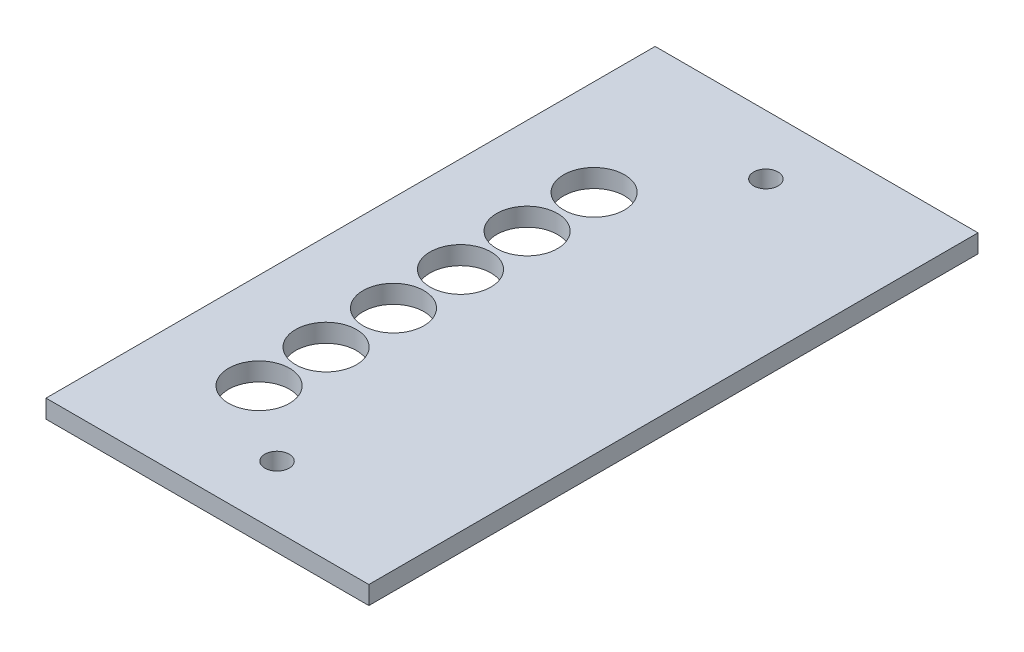
ISO-10303-21;
HEADER;
FILE_DESCRIPTION(('STEP AP214'),'2;1');
FILE_NAME('part.step','',(''),(''),'','','');
FILE_SCHEMA(('AUTOMOTIVE_DESIGN { 1 0 10303 214 1 1 1 1 }'));
ENDSEC;
DATA;
#1=APPLICATION_CONTEXT('core data for automotive mechanical design processes');
#2=APPLICATION_PROTOCOL_DEFINITION('international standard','automotive_design',2000,#1);
#3=PRODUCT_CONTEXT('',#1,'mechanical');
#4=PRODUCT('Part','Part','',(#3));
#5=PRODUCT_RELATED_PRODUCT_CATEGORY('part','',(#4));
#6=PRODUCT_DEFINITION_FORMATION('','',#4);
#7=PRODUCT_DEFINITION_CONTEXT('part definition',#1,'design');
#8=PRODUCT_DEFINITION('design','',#6,#7);
#9=PRODUCT_DEFINITION_SHAPE('','',#8);
#10=(LENGTH_UNIT() NAMED_UNIT(*) SI_UNIT(.MILLI.,.METRE.));
#11=(NAMED_UNIT(*) PLANE_ANGLE_UNIT() SI_UNIT($,.RADIAN.));
#12=(NAMED_UNIT(*) SI_UNIT($,.STERADIAN.) SOLID_ANGLE_UNIT());
#13=UNCERTAINTY_MEASURE_WITH_UNIT(LENGTH_MEASURE(1.E-05),#10,'distance_accuracy_value','');
#14=(GEOMETRIC_REPRESENTATION_CONTEXT(3) GLOBAL_UNCERTAINTY_ASSIGNED_CONTEXT((#13)) GLOBAL_UNIT_ASSIGNED_CONTEXT((#10,
#11,#12)) REPRESENTATION_CONTEXT('',''));
#15=CARTESIAN_POINT('',(0.,0.,0.));
#16=DIRECTION('',(0.,0.,1.));
#17=DIRECTION('',(1.,0.,0.));
#18=AXIS2_PLACEMENT_3D('',#15,#16,#17);
#19=CARTESIAN_POINT('',(-55.7335730143766,3.,-105.758743908447));
#20=DIRECTION('',(1.,0.,0.));
#21=DIRECTION('',(0.,0.,-1.));
#22=AXIS2_PLACEMENT_3D('',#19,#20,#21);
#23=PLANE('',#22);
#24=DIRECTION('',(0.,0.,1.));
#25=VECTOR('',#24,1.);
#26=CARTESIAN_POINT('',(-55.7335730143766,0.,-105.758743908447));
#27=LINE('',#26,#25);
#28=CARTESIAN_POINT('',(-55.7335730143766,0.,-105.758743908447));
#29=VERTEX_POINT('',#28);
#30=CARTESIAN_POINT('',(-55.7335730143766,0.,-5.75874390844709));
#31=VERTEX_POINT('',#30);
#32=EDGE_CURVE('E112',#29,#31,#27,.T.);
#33=ORIENTED_EDGE('',*,*,#32,.T.);
#34=DIRECTION('',(0.,-1.,0.));
#35=VECTOR('',#34,1.);
#36=CARTESIAN_POINT('',(-55.7335730143766,3.,-5.75874390844709));
#37=LINE('',#36,#35);
#38=CARTESIAN_POINT('',(-55.7335730143766,3.,-5.75874390844709));
#39=VERTEX_POINT('',#38);
#40=EDGE_CURVE('E11',#39,#31,#37,.T.);
#41=ORIENTED_EDGE('',*,*,#40,.F.);
#42=DIRECTION('',(0.,0.,1.));
#43=VECTOR('',#42,1.);
#44=CARTESIAN_POINT('',(-55.7335730143766,3.,-105.758743908447));
#45=LINE('',#44,#43);
#46=CARTESIAN_POINT('',(-55.7335730143766,3.,-105.758743908447));
#47=VERTEX_POINT('',#46);
#48=EDGE_CURVE('E93',#47,#39,#45,.T.);
#49=ORIENTED_EDGE('',*,*,#48,.F.);
#50=DIRECTION('',(0.,-1.,0.));
#51=VECTOR('',#50,1.);
#52=CARTESIAN_POINT('',(-55.7335730143766,3.,-105.758743908447));
#53=LINE('',#52,#51);
#54=EDGE_CURVE('E60',#47,#29,#53,.T.);
#55=ORIENTED_EDGE('',*,*,#54,.T.);
#56=EDGE_LOOP('',(#33,#41,#49,#55));
#57=FACE_BOUND('',#56,.T.);
#58=ADVANCED_FACE('F41',(#57),#23,.F.);
#59=CARTESIAN_POINT('',(-55.7335730143766,3.,-5.75874390844709));
#60=DIRECTION('',(0.,0.,-1.));
#61=DIRECTION('',(-1.,0.,0.));
#62=AXIS2_PLACEMENT_3D('',#59,#60,#61);
#63=PLANE('',#62);
#64=DIRECTION('',(1.,0.,0.));
#65=VECTOR('',#64,1.);
#66=CARTESIAN_POINT('',(-55.7335730143766,0.,-5.75874390844709));
#67=LINE('',#66,#65);
#68=CARTESIAN_POINT('',(-2.73357301437657,0.,-5.75874390844709));
#69=VERTEX_POINT('',#68);
#70=EDGE_CURVE('E99',#31,#69,#67,.T.);
#71=ORIENTED_EDGE('',*,*,#70,.T.);
#72=DIRECTION('',(0.,-1.,0.));
#73=VECTOR('',#72,1.);
#74=CARTESIAN_POINT('',(-2.73357301437657,3.,-5.75874390844709));
#75=LINE('',#74,#73);
#76=CARTESIAN_POINT('',(-2.73357301437657,3.,-5.75874390844709));
#77=VERTEX_POINT('',#76);
#78=EDGE_CURVE('E51',#77,#69,#75,.T.);
#79=ORIENTED_EDGE('',*,*,#78,.F.);
#80=DIRECTION('',(1.,0.,0.));
#81=VECTOR('',#80,1.);
#82=CARTESIAN_POINT('',(-55.7335730143766,3.,-5.75874390844709));
#83=LINE('',#82,#81);
#84=EDGE_CURVE('E85',#39,#77,#83,.T.);
#85=ORIENTED_EDGE('',*,*,#84,.F.);
#86=ORIENTED_EDGE('',*,*,#40,.T.);
#87=EDGE_LOOP('',(#71,#79,#85,#86));
#88=FACE_BOUND('',#87,.T.);
#89=ADVANCED_FACE('F98',(#88),#63,.F.);
#90=CARTESIAN_POINT('',(-2.73357301437659,3.,-105.758743908447));
#91=DIRECTION('',(1.,0.,0.));
#92=DIRECTION('',(0.,0.,-1.));
#93=AXIS2_PLACEMENT_3D('',#90,#91,#92);
#94=PLANE('',#93);
#95=DIRECTION('',(0.,0.,1.));
#96=VECTOR('',#95,1.);
#97=CARTESIAN_POINT('',(-2.73357301437659,0.,-105.758743908447));
#98=LINE('',#97,#96);
#99=CARTESIAN_POINT('',(-2.73357301437659,0.,-105.758743908447));
#100=VERTEX_POINT('',#99);
#101=EDGE_CURVE('E118',#100,#69,#98,.T.);
#102=ORIENTED_EDGE('',*,*,#101,.F.);
#103=DIRECTION('',(0.,-1.,0.));
#104=VECTOR('',#103,1.);
#105=CARTESIAN_POINT('',(-2.73357301437659,3.,-105.758743908447));
#106=LINE('',#105,#104);
#107=CARTESIAN_POINT('',(-2.73357301437659,3.,-105.758743908447));
#108=VERTEX_POINT('',#107);
#109=EDGE_CURVE('E74',#108,#100,#106,.T.);
#110=ORIENTED_EDGE('',*,*,#109,.F.);
#111=DIRECTION('',(0.,0.,1.));
#112=VECTOR('',#111,1.);
#113=CARTESIAN_POINT('',(-2.73357301437659,3.,-105.758743908447));
#114=LINE('',#113,#112);
#115=EDGE_CURVE('E92',#108,#77,#114,.T.);
#116=ORIENTED_EDGE('',*,*,#115,.T.);
#117=ORIENTED_EDGE('',*,*,#78,.T.);
#118=EDGE_LOOP('',(#102,#110,#116,#117));
#119=FACE_BOUND('',#118,.T.);
#120=ADVANCED_FACE('F104',(#119),#94,.T.);
#121=CARTESIAN_POINT('',(-55.7335730143766,3.,-105.758743908447));
#122=DIRECTION('',(0.,0.,-1.));
#123=DIRECTION('',(-1.,0.,0.));
#124=AXIS2_PLACEMENT_3D('',#121,#122,#123);
#125=PLANE('',#124);
#126=DIRECTION('',(1.,0.,0.));
#127=VECTOR('',#126,1.);
#128=CARTESIAN_POINT('',(-55.7335730143766,0.,-105.758743908447));
#129=LINE('',#128,#127);
#130=EDGE_CURVE('E121',#29,#100,#129,.T.);
#131=ORIENTED_EDGE('',*,*,#130,.F.);
#132=ORIENTED_EDGE('',*,*,#54,.F.);
#133=DIRECTION('',(1.,0.,0.));
#134=VECTOR('',#133,1.);
#135=CARTESIAN_POINT('',(-55.7335730143766,3.,-105.758743908447));
#136=LINE('',#135,#134);
#137=EDGE_CURVE('E106',#47,#108,#136,.T.);
#138=ORIENTED_EDGE('',*,*,#137,.T.);
#139=ORIENTED_EDGE('',*,*,#109,.T.);
#140=EDGE_LOOP('',(#131,#132,#138,#139));
#141=FACE_BOUND('',#140,.T.);
#142=ADVANCED_FACE('F214',(#141),#125,.T.);
#143=CARTESIAN_POINT('',(0.,3.,0.));
#144=DIRECTION('',(0.,1.,0.));
#145=DIRECTION('',(0.,0.,1.));
#146=AXIS2_PLACEMENT_3D('',#143,#144,#145);
#147=PLANE('',#146);
#148=CARTESIAN_POINT('',(-27.8029030923638,3.,-96.));
#149=DIRECTION('',(0.,1.,0.));
#150=DIRECTION('',(0.,0.,1.));
#151=AXIS2_PLACEMENT_3D('',#148,#149,#150);
#152=CIRCLE('',#151,2.);
#153=CARTESIAN_POINT('',(-27.8029030923638,3.,-94.));
#154=VERTEX_POINT('',#153);
#155=EDGE_CURVE('E188',#154,#154,#152,.T.);
#156=ORIENTED_EDGE('',*,*,#155,.F.);
#157=EDGE_LOOP('',(#156));
#158=FACE_BOUND('',#157,.T.);
#159=CARTESIAN_POINT('',(-40.,3.,-25.));
#160=DIRECTION('',(0.,1.,0.));
#161=DIRECTION('',(0.,0.,1.));
#162=AXIS2_PLACEMENT_3D('',#159,#160,#161);
#163=CIRCLE('',#162,5.);
#164=CARTESIAN_POINT('',(-40.,3.,-20.));
#165=VERTEX_POINT('',#164);
#166=EDGE_CURVE('E138',#165,#165,#163,.T.);
#167=ORIENTED_EDGE('',*,*,#166,.F.);
#168=EDGE_LOOP('',(#167));
#169=FACE_BOUND('',#168,.T.);
#170=CARTESIAN_POINT('',(-40.,3.,-36.));
#171=DIRECTION('',(0.,1.,0.));
#172=DIRECTION('',(0.,0.,1.));
#173=AXIS2_PLACEMENT_3D('',#170,#171,#172);
#174=CIRCLE('',#173,5.);
#175=CARTESIAN_POINT('',(-40.,3.,-31.));
#176=VERTEX_POINT('',#175);
#177=EDGE_CURVE('E181',#176,#176,#174,.T.);
#178=ORIENTED_EDGE('',*,*,#177,.F.);
#179=EDGE_LOOP('',(#178));
#180=FACE_BOUND('',#179,.T.);
#181=CARTESIAN_POINT('',(-40.,3.,-47.07));
#182=DIRECTION('',(0.,1.,0.));
#183=DIRECTION('',(0.,0.,1.));
#184=AXIS2_PLACEMENT_3D('',#181,#182,#183);
#185=CIRCLE('',#184,5.);
#186=CARTESIAN_POINT('',(-40.,3.,-42.07));
#187=VERTEX_POINT('',#186);
#188=EDGE_CURVE('E177',#187,#187,#185,.T.);
#189=ORIENTED_EDGE('',*,*,#188,.F.);
#190=EDGE_LOOP('',(#189));
#191=FACE_BOUND('',#190,.T.);
#192=CARTESIAN_POINT('',(-40.,3.,-58.07));
#193=DIRECTION('',(0.,1.,0.));
#194=DIRECTION('',(0.,0.,1.));
#195=AXIS2_PLACEMENT_3D('',#192,#193,#194);
#196=CIRCLE('',#195,5.);
#197=CARTESIAN_POINT('',(-40.,3.,-53.07));
#198=VERTEX_POINT('',#197);
#199=EDGE_CURVE('E173',#198,#198,#196,.T.);
#200=ORIENTED_EDGE('',*,*,#199,.F.);
#201=EDGE_LOOP('',(#200));
#202=FACE_BOUND('',#201,.T.);
#203=CARTESIAN_POINT('',(-40.,3.,-69.));
#204=DIRECTION('',(0.,1.,0.));
#205=DIRECTION('',(0.,0.,1.));
#206=AXIS2_PLACEMENT_3D('',#203,#204,#205);
#207=CIRCLE('',#206,5.00000000000001);
#208=CARTESIAN_POINT('',(-40.,3.,-64.));
#209=VERTEX_POINT('',#208);
#210=EDGE_CURVE('E169',#209,#209,#207,.T.);
#211=ORIENTED_EDGE('',*,*,#210,.F.);
#212=EDGE_LOOP('',(#211));
#213=FACE_BOUND('',#212,.T.);
#214=CARTESIAN_POINT('',(-40.,3.,-80.));
#215=DIRECTION('',(0.,1.,0.));
#216=DIRECTION('',(0.,0.,1.));
#217=AXIS2_PLACEMENT_3D('',#214,#215,#216);
#218=CIRCLE('',#217,5.00000000000001);
#219=CARTESIAN_POINT('',(-40.,3.,-75.));
#220=VERTEX_POINT('',#219);
#221=EDGE_CURVE('E164',#220,#220,#218,.T.);
#222=ORIENTED_EDGE('',*,*,#221,.F.);
#223=EDGE_LOOP('',(#222));
#224=FACE_BOUND('',#223,.T.);
#225=CARTESIAN_POINT('',(-27.8029030923637,3.,-15.7587439084471));
#226=DIRECTION('',(0.,1.,0.));
#227=DIRECTION('',(0.,0.,1.));
#228=AXIS2_PLACEMENT_3D('',#225,#226,#227);
#229=CIRCLE('',#228,2.);
#230=CARTESIAN_POINT('',(-27.8029030923637,3.,-13.7587439084471));
#231=VERTEX_POINT('',#230);
#232=EDGE_CURVE('E132',#231,#231,#229,.T.);
#233=ORIENTED_EDGE('',*,*,#232,.F.);
#234=EDGE_LOOP('',(#233));
#235=FACE_BOUND('',#234,.T.);
#236=ORIENTED_EDGE('',*,*,#48,.T.);
#237=ORIENTED_EDGE('',*,*,#84,.T.);
#238=ORIENTED_EDGE('',*,*,#115,.F.);
#239=ORIENTED_EDGE('',*,*,#137,.F.);
#240=EDGE_LOOP('',(#236,#237,#238,#239));
#241=FACE_BOUND('',#240,.T.);
#242=ADVANCED_FACE('F89',(#158,#169,#180,#191,#202,#213,#224,#235,#241),#147,.T.);
#243=CARTESIAN_POINT('',(0.,0.,0.));
#244=DIRECTION('',(0.,1.,0.));
#245=DIRECTION('',(0.,0.,1.));
#246=AXIS2_PLACEMENT_3D('',#243,#244,#245);
#247=PLANE('',#246);
#248=CARTESIAN_POINT('',(-27.8029030923638,0.,-96.));
#249=DIRECTION('',(0.,1.,0.));
#250=DIRECTION('',(0.,0.,1.));
#251=AXIS2_PLACEMENT_3D('',#248,#249,#250);
#252=CIRCLE('',#251,2.);
#253=CARTESIAN_POINT('',(-27.8029030923638,0.,-94.));
#254=VERTEX_POINT('',#253);
#255=EDGE_CURVE('E44',#254,#254,#252,.T.);
#256=ORIENTED_EDGE('',*,*,#255,.T.);
#257=EDGE_LOOP('',(#256));
#258=FACE_BOUND('',#257,.T.);
#259=CARTESIAN_POINT('',(-40.,0.,-25.));
#260=DIRECTION('',(0.,1.,0.));
#261=DIRECTION('',(0.,0.,1.));
#262=AXIS2_PLACEMENT_3D('',#259,#260,#261);
#263=CIRCLE('',#262,5.);
#264=CARTESIAN_POINT('',(-40.,0.,-20.));
#265=VERTEX_POINT('',#264);
#266=EDGE_CURVE('E153',#265,#265,#263,.T.);
#267=ORIENTED_EDGE('',*,*,#266,.T.);
#268=EDGE_LOOP('',(#267));
#269=FACE_BOUND('',#268,.T.);
#270=CARTESIAN_POINT('',(-40.,0.,-36.));
#271=DIRECTION('',(0.,1.,0.));
#272=DIRECTION('',(0.,0.,1.));
#273=AXIS2_PLACEMENT_3D('',#270,#271,#272);
#274=CIRCLE('',#273,5.);
#275=CARTESIAN_POINT('',(-40.,0.,-31.));
#276=VERTEX_POINT('',#275);
#277=EDGE_CURVE('E150',#276,#276,#274,.T.);
#278=ORIENTED_EDGE('',*,*,#277,.T.);
#279=EDGE_LOOP('',(#278));
#280=FACE_BOUND('',#279,.T.);
#281=CARTESIAN_POINT('',(-40.,0.,-47.07));
#282=DIRECTION('',(0.,1.,0.));
#283=DIRECTION('',(0.,0.,1.));
#284=AXIS2_PLACEMENT_3D('',#281,#282,#283);
#285=CIRCLE('',#284,5.);
#286=CARTESIAN_POINT('',(-40.,0.,-42.07));
#287=VERTEX_POINT('',#286);
#288=EDGE_CURVE('E146',#287,#287,#285,.T.);
#289=ORIENTED_EDGE('',*,*,#288,.T.);
#290=EDGE_LOOP('',(#289));
#291=FACE_BOUND('',#290,.T.);
#292=CARTESIAN_POINT('',(-40.,0.,-58.07));
#293=DIRECTION('',(0.,1.,0.));
#294=DIRECTION('',(0.,0.,1.));
#295=AXIS2_PLACEMENT_3D('',#292,#293,#294);
#296=CIRCLE('',#295,5.);
#297=CARTESIAN_POINT('',(-40.,0.,-53.07));
#298=VERTEX_POINT('',#297);
#299=EDGE_CURVE('E142',#298,#298,#296,.T.);
#300=ORIENTED_EDGE('',*,*,#299,.T.);
#301=EDGE_LOOP('',(#300));
#302=FACE_BOUND('',#301,.T.);
#303=CARTESIAN_POINT('',(-40.,0.,-69.));
#304=DIRECTION('',(0.,1.,0.));
#305=DIRECTION('',(0.,0.,1.));
#306=AXIS2_PLACEMENT_3D('',#303,#304,#305);
#307=CIRCLE('',#306,5.00000000000001);
#308=CARTESIAN_POINT('',(-40.,0.,-64.));
#309=VERTEX_POINT('',#308);
#310=EDGE_CURVE('E137',#309,#309,#307,.T.);
#311=ORIENTED_EDGE('',*,*,#310,.T.);
#312=EDGE_LOOP('',(#311));
#313=FACE_BOUND('',#312,.T.);
#314=CARTESIAN_POINT('',(-40.,0.,-80.));
#315=DIRECTION('',(0.,1.,0.));
#316=DIRECTION('',(0.,0.,1.));
#317=AXIS2_PLACEMENT_3D('',#314,#315,#316);
#318=CIRCLE('',#317,5.00000000000001);
#319=CARTESIAN_POINT('',(-40.,0.,-75.));
#320=VERTEX_POINT('',#319);
#321=EDGE_CURVE('E133',#320,#320,#318,.T.);
#322=ORIENTED_EDGE('',*,*,#321,.T.);
#323=EDGE_LOOP('',(#322));
#324=FACE_BOUND('',#323,.T.);
#325=CARTESIAN_POINT('',(-27.8029030923637,0.,-15.7587439084471));
#326=DIRECTION('',(0.,1.,0.));
#327=DIRECTION('',(0.,0.,1.));
#328=AXIS2_PLACEMENT_3D('',#325,#326,#327);
#329=CIRCLE('',#328,2.);
#330=CARTESIAN_POINT('',(-27.8029030923637,0.,-13.7587439084471));
#331=VERTEX_POINT('',#330);
#332=EDGE_CURVE('E115',#331,#331,#329,.T.);
#333=ORIENTED_EDGE('',*,*,#332,.T.);
#334=EDGE_LOOP('',(#333));
#335=FACE_BOUND('',#334,.T.);
#336=ORIENTED_EDGE('',*,*,#32,.F.);
#337=ORIENTED_EDGE('',*,*,#130,.T.);
#338=ORIENTED_EDGE('',*,*,#101,.T.);
#339=ORIENTED_EDGE('',*,*,#70,.F.);
#340=EDGE_LOOP('',(#336,#337,#338,#339));
#341=FACE_BOUND('',#340,.T.);
#342=ADVANCED_FACE('F197',(#258,#269,#280,#291,#302,#313,#324,#335,#341),#247,.F.);
#343=CARTESIAN_POINT('',(-27.8029030923637,-7.,-15.7587439084471));
#344=DIRECTION('',(0.,1.,0.));
#345=DIRECTION('',(0.,0.,1.));
#346=AXIS2_PLACEMENT_3D('',#343,#344,#345);
#347=CYLINDRICAL_SURFACE('',#346,2.);
#348=ORIENTED_EDGE('',*,*,#232,.T.);
#349=EDGE_LOOP('',(#348));
#350=FACE_BOUND('',#349,.T.);
#351=ORIENTED_EDGE('',*,*,#332,.F.);
#352=EDGE_LOOP('',(#351));
#353=FACE_BOUND('',#352,.T.);
#354=ADVANCED_FACE('F227',(#350,#353),#347,.F.);
#355=CARTESIAN_POINT('',(-40.,-7.,-80.));
#356=DIRECTION('',(0.,1.,0.));
#357=DIRECTION('',(0.,0.,1.));
#358=AXIS2_PLACEMENT_3D('',#355,#356,#357);
#359=CYLINDRICAL_SURFACE('',#358,5.00000000000001);
#360=ORIENTED_EDGE('',*,*,#221,.T.);
#361=EDGE_LOOP('',(#360));
#362=FACE_BOUND('',#361,.T.);
#363=ORIENTED_EDGE('',*,*,#321,.F.);
#364=EDGE_LOOP('',(#363));
#365=FACE_BOUND('',#364,.T.);
#366=ADVANCED_FACE('F231',(#362,#365),#359,.F.);
#367=CARTESIAN_POINT('',(-40.,-7.,-69.));
#368=DIRECTION('',(0.,1.,0.));
#369=DIRECTION('',(0.,0.,1.));
#370=AXIS2_PLACEMENT_3D('',#367,#368,#369);
#371=CYLINDRICAL_SURFACE('',#370,5.00000000000001);
#372=ORIENTED_EDGE('',*,*,#210,.T.);
#373=EDGE_LOOP('',(#372));
#374=FACE_BOUND('',#373,.T.);
#375=ORIENTED_EDGE('',*,*,#310,.F.);
#376=EDGE_LOOP('',(#375));
#377=FACE_BOUND('',#376,.T.);
#378=ADVANCED_FACE('F234',(#374,#377),#371,.F.);
#379=CARTESIAN_POINT('',(-40.,-7.,-58.07));
#380=DIRECTION('',(0.,1.,0.));
#381=DIRECTION('',(0.,0.,1.));
#382=AXIS2_PLACEMENT_3D('',#379,#380,#381);
#383=CYLINDRICAL_SURFACE('',#382,5.);
#384=ORIENTED_EDGE('',*,*,#199,.T.);
#385=EDGE_LOOP('',(#384));
#386=FACE_BOUND('',#385,.T.);
#387=ORIENTED_EDGE('',*,*,#299,.F.);
#388=EDGE_LOOP('',(#387));
#389=FACE_BOUND('',#388,.T.);
#390=ADVANCED_FACE('F238',(#386,#389),#383,.F.);
#391=CARTESIAN_POINT('',(-40.,-7.,-47.07));
#392=DIRECTION('',(0.,1.,0.));
#393=DIRECTION('',(0.,0.,1.));
#394=AXIS2_PLACEMENT_3D('',#391,#392,#393);
#395=CYLINDRICAL_SURFACE('',#394,5.);
#396=ORIENTED_EDGE('',*,*,#188,.T.);
#397=EDGE_LOOP('',(#396));
#398=FACE_BOUND('',#397,.T.);
#399=ORIENTED_EDGE('',*,*,#288,.F.);
#400=EDGE_LOOP('',(#399));
#401=FACE_BOUND('',#400,.T.);
#402=ADVANCED_FACE('F242',(#398,#401),#395,.F.);
#403=CARTESIAN_POINT('',(-40.,-7.,-36.));
#404=DIRECTION('',(0.,1.,0.));
#405=DIRECTION('',(0.,0.,1.));
#406=AXIS2_PLACEMENT_3D('',#403,#404,#405);
#407=CYLINDRICAL_SURFACE('',#406,5.);
#408=ORIENTED_EDGE('',*,*,#177,.T.);
#409=EDGE_LOOP('',(#408));
#410=FACE_BOUND('',#409,.T.);
#411=ORIENTED_EDGE('',*,*,#277,.F.);
#412=EDGE_LOOP('',(#411));
#413=FACE_BOUND('',#412,.T.);
#414=ADVANCED_FACE('F206',(#410,#413),#407,.F.);
#415=CARTESIAN_POINT('',(-40.,-7.,-25.));
#416=DIRECTION('',(0.,1.,0.));
#417=DIRECTION('',(0.,0.,1.));
#418=AXIS2_PLACEMENT_3D('',#415,#416,#417);
#419=CYLINDRICAL_SURFACE('',#418,5.);
#420=ORIENTED_EDGE('',*,*,#166,.T.);
#421=EDGE_LOOP('',(#420));
#422=FACE_BOUND('',#421,.T.);
#423=ORIENTED_EDGE('',*,*,#266,.F.);
#424=EDGE_LOOP('',(#423));
#425=FACE_BOUND('',#424,.T.);
#426=ADVANCED_FACE('F201',(#422,#425),#419,.F.);
#427=CARTESIAN_POINT('',(-27.8029030923638,-7.,-96.));
#428=DIRECTION('',(0.,1.,0.));
#429=DIRECTION('',(0.,0.,1.));
#430=AXIS2_PLACEMENT_3D('',#427,#428,#429);
#431=CYLINDRICAL_SURFACE('',#430,2.);
#432=ORIENTED_EDGE('',*,*,#155,.T.);
#433=EDGE_LOOP('',(#432));
#434=FACE_BOUND('',#433,.T.);
#435=ORIENTED_EDGE('',*,*,#255,.F.);
#436=EDGE_LOOP('',(#435));
#437=FACE_BOUND('',#436,.T.);
#438=ADVANCED_FACE('F199',(#434,#437),#431,.F.);
#439=CLOSED_SHELL('',(#58,#89,#120,#142,#242,#342,#354,#366,#378,#390,#402,#414,#426,#438));
#440=MANIFOLD_SOLID_BREP('B2',#439);
#441=ADVANCED_BREP_SHAPE_REPRESENTATION('',(#18,#440),#14);
#442=SHAPE_DEFINITION_REPRESENTATION(#9,#441);
ENDSEC;
END-ISO-10303-21;
